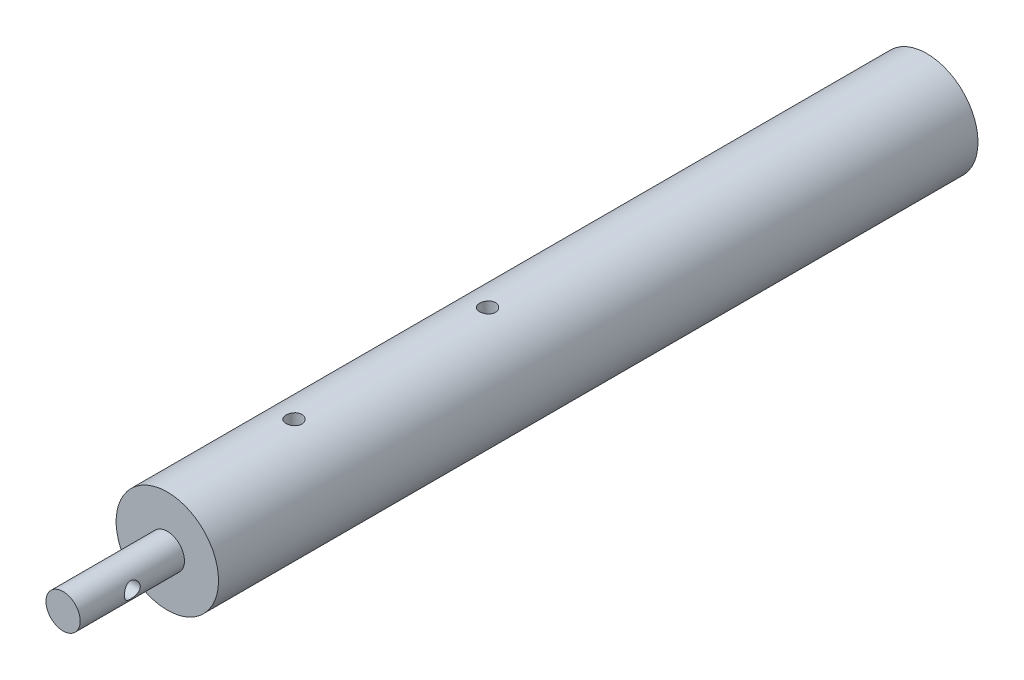
ISO-10303-21;
HEADER;
FILE_DESCRIPTION(('STEP AP214'),'2;1');
FILE_NAME('part.step','',(''),(''),'','','');
FILE_SCHEMA(('AUTOMOTIVE_DESIGN { 1 0 10303 214 1 1 1 1 }'));
ENDSEC;
DATA;
#1=APPLICATION_CONTEXT('core data for automotive mechanical design processes');
#2=APPLICATION_PROTOCOL_DEFINITION('international standard','automotive_design',2000,#1);
#3=PRODUCT_CONTEXT('',#1,'mechanical');
#4=PRODUCT('Part','Part','',(#3));
#5=PRODUCT_RELATED_PRODUCT_CATEGORY('part','',(#4));
#6=PRODUCT_DEFINITION_FORMATION('','',#4);
#7=PRODUCT_DEFINITION_CONTEXT('part definition',#1,'design');
#8=PRODUCT_DEFINITION('design','',#6,#7);
#9=PRODUCT_DEFINITION_SHAPE('','',#8);
#10=(LENGTH_UNIT() NAMED_UNIT(*) SI_UNIT(.MILLI.,.METRE.));
#11=(NAMED_UNIT(*) PLANE_ANGLE_UNIT() SI_UNIT($,.RADIAN.));
#12=(NAMED_UNIT(*) SI_UNIT($,.STERADIAN.) SOLID_ANGLE_UNIT());
#13=UNCERTAINTY_MEASURE_WITH_UNIT(LENGTH_MEASURE(1.E-05),#10,'distance_accuracy_value','');
#14=(GEOMETRIC_REPRESENTATION_CONTEXT(3) GLOBAL_UNCERTAINTY_ASSIGNED_CONTEXT((#13)) GLOBAL_UNIT_ASSIGNED_CONTEXT((#10,
#11,#12)) REPRESENTATION_CONTEXT('',''));
#15=CARTESIAN_POINT('',(0.,0.,0.));
#16=DIRECTION('',(0.,0.,1.));
#17=DIRECTION('',(1.,0.,0.));
#18=AXIS2_PLACEMENT_3D('',#15,#16,#17);
#19=CARTESIAN_POINT('',(0.,0.,129.54));
#20=DIRECTION('',(0.,0.,-1.));
#21=DIRECTION('',(-1.,0.,0.));
#22=AXIS2_PLACEMENT_3D('',#19,#20,#21);
#23=CYLINDRICAL_SURFACE('',#22,8.73125);
#24=CARTESIAN_POINT('',(0.,-8.73125,76.28255));
#25=CARTESIAN_POINT('',(0.0754888041344743,-8.73124876355659,76.2825469101338));
#26=CARTESIAN_POINT('',(0.151020673026684,-8.73026076401459,76.2762088651265));
#27=CARTESIAN_POINT('',(0.299971135901253,-8.72641453990347,76.2510317340889));
#28=CARTESIAN_POINT('',(0.373387634254949,-8.72355452308375,76.2321806679732));
#29=CARTESIAN_POINT('',(0.51593036168142,-8.71628549203304,76.1825560147517));
#30=CARTESIAN_POINT('',(0.585059861670591,-8.71187767629343,76.1517916504597));
#31=CARTESIAN_POINT('',(0.717165385587769,-8.70199942370632,76.0792366950341));
#32=CARTESIAN_POINT('',(0.780142219559996,-8.69652912702646,76.0374475580818));
#33=CARTESIAN_POINT('',(0.898688105879225,-8.68508285997865,75.9436594774592));
#34=CARTESIAN_POINT('',(0.954198620113938,-8.67910343334047,75.8915869569925));
#35=CARTESIAN_POINT('',(1.05573089746048,-8.66733970609661,75.7788686056852));
#36=CARTESIAN_POINT('',(1.10175210015955,-8.66155541703209,75.7182222688548));
#37=CARTESIAN_POINT('',(1.18322919600408,-8.65080337197327,75.5896819542717));
#38=CARTESIAN_POINT('',(1.21862809215192,-8.64584008290526,75.521751442051));
#39=CARTESIAN_POINT('',(1.27749141841027,-8.63733941759142,75.3808191306646));
#40=CARTESIAN_POINT('',(1.30095654280437,-8.63380195839608,75.3078176268002));
#41=CARTESIAN_POINT('',(1.335103674863,-8.62858758502677,75.159432660333));
#42=CARTESIAN_POINT('',(1.3458861490265,-8.62689605602233,75.0840728406619));
#43=CARTESIAN_POINT('',(1.35467321633248,-8.6255207421819,74.9325959955976));
#44=CARTESIAN_POINT('',(1.35267859136139,-8.62583683449079,74.8564790168229));
#45=CARTESIAN_POINT('',(1.33605010655079,-8.62842769021077,74.7063603558542));
#46=CARTESIAN_POINT('',(1.32152841426008,-8.63068507074406,74.6323459056313));
#47=CARTESIAN_POINT('',(1.28043372499645,-8.63687698314903,74.4878169258596));
#48=CARTESIAN_POINT('',(1.2538603664106,-8.6408115653453,74.4173025014005));
#49=CARTESIAN_POINT('',(1.18930084093583,-8.64993363369715,74.2814355014135));
#50=CARTESIAN_POINT('',(1.15126742861874,-8.65512628870146,74.2161057366237));
#51=CARTESIAN_POINT('',(1.06490104186895,-8.6661757282809,74.092712997201));
#52=CARTESIAN_POINT('',(1.01656734722758,-8.67203255928264,74.0346505311576));
#53=CARTESIAN_POINT('',(0.910358001619178,-8.68382711776753,73.926790713911));
#54=CARTESIAN_POINT('',(0.852385968704006,-8.68976504124887,73.8770882422591));
#55=CARTESIAN_POINT('',(0.728873335053536,-8.70099472554581,73.7881031045136));
#56=CARTESIAN_POINT('',(0.663332697064362,-8.7062864831806,73.7488204897113));
#57=CARTESIAN_POINT('',(0.526459092617788,-8.71563366764483,73.68178421331));
#58=CARTESIAN_POINT('',(0.455122334055874,-8.71968827668825,73.6540381732983));
#59=CARTESIAN_POINT('',(0.30872489456195,-8.72609756582709,73.6109467166351));
#60=CARTESIAN_POINT('',(0.233664482720333,-8.72845236856858,73.5956004052967));
#61=CARTESIAN_POINT('',(0.082768989086949,-8.7311804087026,73.5778708927511));
#62=CARTESIAN_POINT('',(0.00694957424105651,-8.73157357617247,73.5753573058388));
#63=CARTESIAN_POINT('',(-0.144027755167406,-8.73038839327229,73.5830180750966));
#64=CARTESIAN_POINT('',(-0.219185691530383,-8.72881010812248,73.593192011534));
#65=CARTESIAN_POINT('',(-0.366309450213318,-8.72387168565007,73.6258305946649));
#66=CARTESIAN_POINT('',(-0.43828976699257,-8.72052080277739,73.6482314258392));
#67=CARTESIAN_POINT('',(-0.577473062752964,-8.71241159900896,73.7046204166358));
#68=CARTESIAN_POINT('',(-0.644675804394614,-8.70765320825182,73.7386091514344));
#69=CARTESIAN_POINT('',(-0.772967668445403,-8.69720799668705,73.817512958888));
#70=CARTESIAN_POINT('',(-0.834005571297915,-8.69151428993084,73.8625103822726));
#71=CARTESIAN_POINT('',(-0.947710129386006,-8.67985282423371,73.9620399936837));
#72=CARTESIAN_POINT('',(-1.00037626349964,-8.67388504826244,74.0165727748193));
#73=CARTESIAN_POINT('',(-1.09631924727438,-8.6622844963886,74.134206822428));
#74=CARTESIAN_POINT('',(-1.13950849366452,-8.65665516901023,74.1973799309768));
#75=CARTESIAN_POINT('',(-1.21466197602658,-8.64643090415414,74.3301609103));
#76=CARTESIAN_POINT('',(-1.24662653087527,-8.64183593729311,74.3997685982065));
#77=CARTESIAN_POINT('',(-1.29828884286972,-8.63422588143133,74.5431862367786));
#78=CARTESIAN_POINT('',(-1.31803198999982,-8.63120495319378,74.61697951333));
#79=CARTESIAN_POINT('',(-1.34483507549268,-8.62706973621449,74.7668850000124));
#80=CARTESIAN_POINT('',(-1.35189595338706,-8.62595530623528,74.8429970379393));
#81=CARTESIAN_POINT('',(-1.35311061766236,-8.62576477365821,74.9945059015716));
#82=CARTESIAN_POINT('',(-1.34740218479754,-8.62666691222767,75.0699016312582));
#83=CARTESIAN_POINT('',(-1.32353628439743,-8.630360466635,75.2186467368127));
#84=CARTESIAN_POINT('',(-1.30537884225367,-8.63315187861941,75.2919961168541));
#85=CARTESIAN_POINT('',(-1.25718023866666,-8.6403016618646,75.4345239175232));
#86=CARTESIAN_POINT('',(-1.22714934495711,-8.64465867895042,75.5037058825722));
#87=CARTESIAN_POINT('',(-1.15607012583308,-8.65445029265093,75.6360718184769));
#88=CARTESIAN_POINT('',(-1.11502137756136,-8.65988493062184,75.699255558999));
#89=CARTESIAN_POINT('',(-1.02257358694004,-8.6712891242348,75.8185304257929));
#90=CARTESIAN_POINT('',(-0.971072684240981,-8.67726359548134,75.8745421417275));
#91=CARTESIAN_POINT('',(-0.859397758119664,-8.68903377058451,75.9771767063263));
#92=CARTESIAN_POINT('',(-0.799221726247093,-8.69482943266529,76.0237973747835));
#93=CARTESIAN_POINT('',(-0.6714861094829,-8.7056281708648,76.1065736719689));
#94=CARTESIAN_POINT('',(-0.603885101952576,-8.71062637486132,76.1426660093515));
#95=CARTESIAN_POINT('',(-0.463533483835271,-8.71921940343818,76.2029292093534));
#96=CARTESIAN_POINT('',(-0.39078823669724,-8.72281566494095,76.2271122851136));
#97=CARTESIAN_POINT('',(-0.264773937532857,-8.72738890877982,76.2574513111474));
#98=CARTESIAN_POINT('',(-0.212278515743084,-8.72882929635414,76.2668487416074));
#99=CARTESIAN_POINT('',(-0.106529205403255,-8.7307602717609,76.2793991335783));
#100=CARTESIAN_POINT('',(-0.0532753272539902,-8.73125087260525,76.2825521806363));
#101=CARTESIAN_POINT('',(0.,-8.73125,76.28255));
#102=B_SPLINE_CURVE_WITH_KNOTS('',3,(#24,#25,#26,#27,#28,#29,#30,#31,#32,#33,#34,#35,#36,#37,
#38,#39,#40,#41,#42,#43,#44,#45,#46,#47,#48,#49,#50,#51,#52,#53,#54,#55,#56,#57,#58,#59,#60,#61,
#62,#63,#64,#65,#66,#67,#68,#69,#70,#71,#72,#73,#74,#75,#76,#77,#78,#79,#80,#81,#82,#83,#84,#85,
#86,#87,#88,#89,#90,#91,#92,#93,#94,#95,#96,#97,#98,#99,#100,#101),.UNSPECIFIED.,.T.,.F.,(4,2,2,
2,2,2,2,2,2,2,2,2,2,2,2,2,2,2,2,2,2,2,2,2,2,2,2,2,2,2,2,2,2,2,2,2,2,2,4),(0.,0.226271720971168,
0.452760389707807,0.679074069099414,0.905357912345743,1.13332363210328,1.36130281103837,
1.59048425874515,1.81965237159635,2.04699261869543,2.27431895398595,2.49963068739619,
2.72494918178259,2.95120959183571,3.17748582749426,3.40617834532588,3.63487198886636,
3.86371647871664,4.09254445510565,4.31904275252833,4.54553355706069,4.77085339300516,
4.99618441453623,5.22325553477207,5.45034078409446,5.6794441662781,5.90854103944891,
6.13678186614073,6.36500578353091,6.59077905830418,6.81655187258194,7.04212987219085,
7.26771653055756,7.49561740993336,7.72357113749991,7.95286823466402,8.18192969170311,
8.34162046005021,8.5013090406454),.UNSPECIFIED.);
#103=CARTESIAN_POINT('',(0.,-8.73125,76.28255));
#104=VERTEX_POINT('',#103);
#105=EDGE_CURVE('E51',#104,#104,#102,.T.);
#106=ORIENTED_EDGE('',*,*,#105,.T.);
#107=EDGE_LOOP('',(#106));
#108=FACE_BOUND('',#107,.T.);
#109=CARTESIAN_POINT('',(0.,8.73125,76.28255));
#110=CARTESIAN_POINT('',(-0.0754888041344743,8.73124876355659,76.2825469101338));
#111=CARTESIAN_POINT('',(-0.151020673026684,8.73026076401459,76.2762088651265));
#112=CARTESIAN_POINT('',(-0.299971135901253,8.72641453990347,76.2510317340889));
#113=CARTESIAN_POINT('',(-0.373387634254949,8.72355452308375,76.2321806679732));
#114=CARTESIAN_POINT('',(-0.515930361681424,8.71628549203304,76.1825560147517));
#115=CARTESIAN_POINT('',(-0.585059861670598,8.71187767629343,76.1517916504597));
#116=CARTESIAN_POINT('',(-0.717165385587775,8.70199942370632,76.0792366950341));
#117=CARTESIAN_POINT('',(-0.780142219559999,8.69652912702646,76.0374475580818));
#118=CARTESIAN_POINT('',(-0.898688105879225,8.68508285997865,75.9436594774592));
#119=CARTESIAN_POINT('',(-0.954198620113938,8.67910343334047,75.8915869569925));
#120=CARTESIAN_POINT('',(-1.05573089746048,8.66733970609661,75.7788686056852));
#121=CARTESIAN_POINT('',(-1.10175210015955,8.66155541703209,75.7182222688548));
#122=CARTESIAN_POINT('',(-1.18322919600408,8.65080337197327,75.5896819542717));
#123=CARTESIAN_POINT('',(-1.21862809215192,8.64584008290526,75.521751442051));
#124=CARTESIAN_POINT('',(-1.27749141841027,8.63733941759142,75.3808191306646));
#125=CARTESIAN_POINT('',(-1.30095654280437,8.63380195839608,75.3078176268002));
#126=CARTESIAN_POINT('',(-1.335103674863,8.62858758502677,75.159432660333));
#127=CARTESIAN_POINT('',(-1.3458861490265,8.62689605602233,75.0840728406619));
#128=CARTESIAN_POINT('',(-1.35467321633248,8.6255207421819,74.9325959955976));
#129=CARTESIAN_POINT('',(-1.35267859136139,8.62583683449079,74.8564790168229));
#130=CARTESIAN_POINT('',(-1.33605010655079,8.62842769021077,74.7063603558542));
#131=CARTESIAN_POINT('',(-1.32152841426008,8.63068507074406,74.6323459056313));
#132=CARTESIAN_POINT('',(-1.28043372499645,8.63687698314903,74.4878169258596));
#133=CARTESIAN_POINT('',(-1.2538603664106,8.6408115653453,74.4173025014005));
#134=CARTESIAN_POINT('',(-1.18930084093584,8.64993363369715,74.2814355014135));
#135=CARTESIAN_POINT('',(-1.15126742861875,8.65512628870146,74.2161057366237));
#136=CARTESIAN_POINT('',(-1.06490104186895,8.6661757282809,74.092712997201));
#137=CARTESIAN_POINT('',(-1.01656734722758,8.67203255928264,74.0346505311576));
#138=CARTESIAN_POINT('',(-0.910358001619178,8.68382711776753,73.926790713911));
#139=CARTESIAN_POINT('',(-0.852385968704006,8.68976504124887,73.8770882422591));
#140=CARTESIAN_POINT('',(-0.728873335053536,8.70099472554581,73.7881031045136));
#141=CARTESIAN_POINT('',(-0.663332697064363,8.7062864831806,73.7488204897113));
#142=CARTESIAN_POINT('',(-0.526459092617789,8.71563366764483,73.68178421331));
#143=CARTESIAN_POINT('',(-0.455122334055874,8.71968827668825,73.6540381732983));
#144=CARTESIAN_POINT('',(-0.30872489456195,8.72609756582709,73.6109467166351));
#145=CARTESIAN_POINT('',(-0.233664482720334,8.72845236856858,73.5956004052967));
#146=CARTESIAN_POINT('',(-0.08276898908695,8.7311804087026,73.5778708927511));
#147=CARTESIAN_POINT('',(-0.00694957424105769,8.73157357617247,73.5753573058388));
#148=CARTESIAN_POINT('',(0.144027755167404,8.73038839327229,73.5830180750966));
#149=CARTESIAN_POINT('',(0.219185691530382,8.72881010812248,73.593192011534));
#150=CARTESIAN_POINT('',(0.366309450213317,8.72387168565007,73.6258305946649));
#151=CARTESIAN_POINT('',(0.438289766992569,8.72052080277739,73.6482314258392));
#152=CARTESIAN_POINT('',(0.577473062752964,8.71241159900896,73.7046204166358));
#153=CARTESIAN_POINT('',(0.644675804394613,8.70765320825182,73.7386091514344));
#154=CARTESIAN_POINT('',(0.772967668445402,8.69720799668705,73.817512958888));
#155=CARTESIAN_POINT('',(0.834005571297915,8.69151428993084,73.8625103822726));
#156=CARTESIAN_POINT('',(0.947710129386006,8.67985282423371,73.9620399936837));
#157=CARTESIAN_POINT('',(1.00037626349964,8.67388504826244,74.0165727748193));
#158=CARTESIAN_POINT('',(1.09631924727438,8.6622844963886,74.134206822428));
#159=CARTESIAN_POINT('',(1.13950849366452,8.65665516901023,74.1973799309768));
#160=CARTESIAN_POINT('',(1.21466197602658,8.64643090415414,74.3301609103));
#161=CARTESIAN_POINT('',(1.24662653087527,8.64183593729311,74.3997685982065));
#162=CARTESIAN_POINT('',(1.29828884286972,8.63422588143133,74.5431862367786));
#163=CARTESIAN_POINT('',(1.31803198999982,8.63120495319378,74.61697951333));
#164=CARTESIAN_POINT('',(1.34483507549268,8.62706973621449,74.7668850000124));
#165=CARTESIAN_POINT('',(1.35189595338706,8.62595530623528,74.8429970379393));
#166=CARTESIAN_POINT('',(1.35311061766236,8.62576477365821,74.9945059015716));
#167=CARTESIAN_POINT('',(1.34740218479754,8.62666691222767,75.0699016312582));
#168=CARTESIAN_POINT('',(1.32353628439743,8.63036046663499,75.2186467368127));
#169=CARTESIAN_POINT('',(1.30537884225368,8.63315187861941,75.291996116854));
#170=CARTESIAN_POINT('',(1.25718023866667,8.64030166186461,75.4345239175232));
#171=CARTESIAN_POINT('',(1.22714934495711,8.64465867895042,75.5037058825722));
#172=CARTESIAN_POINT('',(1.15607012583308,8.65445029265093,75.6360718184769));
#173=CARTESIAN_POINT('',(1.11502137756136,8.65988493062184,75.699255558999));
#174=CARTESIAN_POINT('',(1.02257358694004,8.6712891242348,75.8185304257929));
#175=CARTESIAN_POINT('',(0.971072684240981,8.67726359548134,75.8745421417275));
#176=CARTESIAN_POINT('',(0.859397758119664,8.68903377058451,75.9771767063263));
#177=CARTESIAN_POINT('',(0.799221726247093,8.69482943266529,76.0237973747835));
#178=CARTESIAN_POINT('',(0.6714861094829,8.7056281708648,76.1065736719689));
#179=CARTESIAN_POINT('',(0.603885101952576,8.71062637486132,76.1426660093515));
#180=CARTESIAN_POINT('',(0.463533483835272,8.71921940343818,76.2029292093534));
#181=CARTESIAN_POINT('',(0.39078823669724,8.72281566494095,76.2271122851136));
#182=CARTESIAN_POINT('',(0.264773937532857,8.72738890877982,76.2574513111474));
#183=CARTESIAN_POINT('',(0.212278515743085,8.72882929635414,76.2668487416074));
#184=CARTESIAN_POINT('',(0.106529205403255,8.7307602717609,76.2793991335783));
#185=CARTESIAN_POINT('',(0.0532753272539903,8.73125087260526,76.2825521806363));
#186=CARTESIAN_POINT('',(0.,8.73125,76.28255));
#187=B_SPLINE_CURVE_WITH_KNOTS('',3,(#109,#110,#111,#112,#113,#114,#115,#116,#117,#118,#119,
#120,#121,#122,#123,#124,#125,#126,#127,#128,#129,#130,#131,#132,#133,#134,#135,#136,#137,#138,
#139,#140,#141,#142,#143,#144,#145,#146,#147,#148,#149,#150,#151,#152,#153,#154,#155,#156,#157,
#158,#159,#160,#161,#162,#163,#164,#165,#166,#167,#168,#169,#170,#171,#172,#173,#174,#175,#176,
#177,#178,#179,#180,#181,#182,#183,#184,#185,#186),.UNSPECIFIED.,.T.,.F.,(4,2,2,2,2,2,2,2,2,2,2,
2,2,2,2,2,2,2,2,2,2,2,2,2,2,2,2,2,2,2,2,2,2,2,2,2,2,2,4),(0.,0.226271720971168,
0.452760389707807,0.67907406909943,0.905357912345742,1.13332363210328,1.36130281103836,
1.59048425874515,1.81965237159635,2.04699261869543,2.27431895398595,2.49963068739619,
2.72494918178258,2.95120959183571,3.17748582749426,3.40617834532588,3.63487198886636,
3.86371647871663,4.09254445510565,4.31904275252832,4.54553355706069,4.77085339300516,
4.99618441453623,5.22325553477207,5.45034078409446,5.6794441662781,5.90854103944891,
6.13678186614073,6.36500578353091,6.59077905830416,6.81655187258193,7.04212987219085,
7.26771653055756,7.49561740993337,7.72357113749991,7.95286823466402,8.18192969170311,
8.34162046005021,8.5013090406454),.UNSPECIFIED.);
#188=CARTESIAN_POINT('',(0.,8.73125,76.28255));
#189=VERTEX_POINT('',#188);
#190=EDGE_CURVE('E55',#189,#189,#187,.T.);
#191=ORIENTED_EDGE('',*,*,#190,.T.);
#192=EDGE_LOOP('',(#191));
#193=FACE_BOUND('',#192,.T.);
#194=CARTESIAN_POINT('',(0.,-8.73125,109.30255));
#195=CARTESIAN_POINT('',(0.0754888041344743,-8.73124876355659,109.302546910134));
#196=CARTESIAN_POINT('',(0.151020673026684,-8.73026076401459,109.296208865126));
#197=CARTESIAN_POINT('',(0.299971135901253,-8.72641453990347,109.271031734089));
#198=CARTESIAN_POINT('',(0.373387634254949,-8.72355452308375,109.252180667973));
#199=CARTESIAN_POINT('',(0.51593036168142,-8.71628549203304,109.202556014752));
#200=CARTESIAN_POINT('',(0.585059861670591,-8.71187767629343,109.17179165046));
#201=CARTESIAN_POINT('',(0.717165385587769,-8.70199942370632,109.099236695034));
#202=CARTESIAN_POINT('',(0.780142219559996,-8.69652912702646,109.057447558082));
#203=CARTESIAN_POINT('',(0.898688105879225,-8.68508285997865,108.963659477459));
#204=CARTESIAN_POINT('',(0.954198620113938,-8.67910343334047,108.911586956993));
#205=CARTESIAN_POINT('',(1.05573089746048,-8.66733970609661,108.798868605685));
#206=CARTESIAN_POINT('',(1.10175210015955,-8.66155541703209,108.738222268855));
#207=CARTESIAN_POINT('',(1.18322919600408,-8.65080337197327,108.609681954272));
#208=CARTESIAN_POINT('',(1.21862809215192,-8.64584008290526,108.541751442051));
#209=CARTESIAN_POINT('',(1.27749141841027,-8.63733941759142,108.400819130665));
#210=CARTESIAN_POINT('',(1.30095654280437,-8.63380195839608,108.3278176268));
#211=CARTESIAN_POINT('',(1.335103674863,-8.62858758502677,108.179432660333));
#212=CARTESIAN_POINT('',(1.3458861490265,-8.62689605602233,108.104072840662));
#213=CARTESIAN_POINT('',(1.35467321633248,-8.6255207421819,107.952595995598));
#214=CARTESIAN_POINT('',(1.35267859136139,-8.62583683449079,107.876479016823));
#215=CARTESIAN_POINT('',(1.33605010655079,-8.62842769021077,107.726360355854));
#216=CARTESIAN_POINT('',(1.32152841426008,-8.63068507074407,107.652345905631));
#217=CARTESIAN_POINT('',(1.28043372499645,-8.63687698314903,107.50781692586));
#218=CARTESIAN_POINT('',(1.2538603664106,-8.6408115653453,107.437302501401));
#219=CARTESIAN_POINT('',(1.18930084093583,-8.64993363369715,107.301435501414));
#220=CARTESIAN_POINT('',(1.15126742861874,-8.65512628870146,107.236105736624));
#221=CARTESIAN_POINT('',(1.06490104186894,-8.6661757282809,107.112712997201));
#222=CARTESIAN_POINT('',(1.01656734722758,-8.67203255928264,107.054650531158));
#223=CARTESIAN_POINT('',(0.910358001619178,-8.68382711776753,106.946790713911));
#224=CARTESIAN_POINT('',(0.852385968704006,-8.68976504124887,106.897088242259));
#225=CARTESIAN_POINT('',(0.728873335053536,-8.70099472554581,106.808103104514));
#226=CARTESIAN_POINT('',(0.663332697064363,-8.7062864831806,106.768820489711));
#227=CARTESIAN_POINT('',(0.526459092617786,-8.71563366764483,106.70178421331));
#228=CARTESIAN_POINT('',(0.455122334055869,-8.71968827668825,106.674038173298));
#229=CARTESIAN_POINT('',(0.308724894561944,-8.72609756582709,106.630946716635));
#230=CARTESIAN_POINT('',(0.23366448272033,-8.72845236856858,106.615600405297));
#231=CARTESIAN_POINT('',(0.0827689890869492,-8.7311804087026,106.597870892751));
#232=CARTESIAN_POINT('',(0.00694957424105654,-8.73157357617247,106.595357305839));
#233=CARTESIAN_POINT('',(-0.144027755167406,-8.73038839327229,106.603018075097));
#234=CARTESIAN_POINT('',(-0.219185691530383,-8.72881010812248,106.613192011534));
#235=CARTESIAN_POINT('',(-0.366309450213318,-8.72387168565007,106.645830594665));
#236=CARTESIAN_POINT('',(-0.43828976699257,-8.72052080277739,106.668231425839));
#237=CARTESIAN_POINT('',(-0.577473062752964,-8.71241159900896,106.724620416636));
#238=CARTESIAN_POINT('',(-0.644675804394614,-8.70765320825182,106.758609151434));
#239=CARTESIAN_POINT('',(-0.772967668445403,-8.69720799668705,106.837512958888));
#240=CARTESIAN_POINT('',(-0.834005571297915,-8.69151428993084,106.882510382273));
#241=CARTESIAN_POINT('',(-0.947710129386006,-8.67985282423371,106.982039993684));
#242=CARTESIAN_POINT('',(-1.00037626349964,-8.67388504826244,107.036572774819));
#243=CARTESIAN_POINT('',(-1.09631924727438,-8.6622844963886,107.154206822428));
#244=CARTESIAN_POINT('',(-1.13950849366452,-8.65665516901023,107.217379930977));
#245=CARTESIAN_POINT('',(-1.21466197602658,-8.64643090415414,107.3501609103));
#246=CARTESIAN_POINT('',(-1.24662653087527,-8.64183593729311,107.419768598207));
#247=CARTESIAN_POINT('',(-1.29828884286972,-8.63422588143133,107.563186236779));
#248=CARTESIAN_POINT('',(-1.31803198999982,-8.63120495319378,107.63697951333));
#249=CARTESIAN_POINT('',(-1.34483507549268,-8.62706973621449,107.786885000012));
#250=CARTESIAN_POINT('',(-1.35189595338706,-8.62595530623528,107.862997037939));
#251=CARTESIAN_POINT('',(-1.35311061766236,-8.62576477365821,108.014505901572));
#252=CARTESIAN_POINT('',(-1.34740218479754,-8.62666691222767,108.089901631258));
#253=CARTESIAN_POINT('',(-1.32353628439743,-8.630360466635,108.238646736813));
#254=CARTESIAN_POINT('',(-1.30537884225367,-8.63315187861941,108.311996116854));
#255=CARTESIAN_POINT('',(-1.25718023866666,-8.6403016618646,108.454523917523));
#256=CARTESIAN_POINT('',(-1.22714934495711,-8.64465867895042,108.523705882572));
#257=CARTESIAN_POINT('',(-1.15607012583308,-8.65445029265093,108.656071818477));
#258=CARTESIAN_POINT('',(-1.11502137756136,-8.65988493062184,108.719255558999));
#259=CARTESIAN_POINT('',(-1.02257358694004,-8.6712891242348,108.838530425793));
#260=CARTESIAN_POINT('',(-0.971072684240981,-8.67726359548134,108.894542141728));
#261=CARTESIAN_POINT('',(-0.859397758119664,-8.68903377058451,108.997176706326));
#262=CARTESIAN_POINT('',(-0.799221726247093,-8.69482943266529,109.043797374783));
#263=CARTESIAN_POINT('',(-0.6714861094829,-8.7056281708648,109.126573671969));
#264=CARTESIAN_POINT('',(-0.603885101952576,-8.71062637486132,109.162666009351));
#265=CARTESIAN_POINT('',(-0.463533483835271,-8.71921940343818,109.222929209353));
#266=CARTESIAN_POINT('',(-0.39078823669724,-8.72281566494095,109.247112285114));
#267=CARTESIAN_POINT('',(-0.264773937532857,-8.72738890877982,109.277451311147));
#268=CARTESIAN_POINT('',(-0.212278515743084,-8.72882929635414,109.286848741607));
#269=CARTESIAN_POINT('',(-0.106529205403255,-8.7307602717609,109.299399133578));
#270=CARTESIAN_POINT('',(-0.0532753272539902,-8.73125087260525,109.302552180636));
#271=CARTESIAN_POINT('',(0.,-8.73125,109.30255));
#272=B_SPLINE_CURVE_WITH_KNOTS('',3,(#194,#195,#196,#197,#198,#199,#200,#201,#202,#203,#204,
#205,#206,#207,#208,#209,#210,#211,#212,#213,#214,#215,#216,#217,#218,#219,#220,#221,#222,#223,
#224,#225,#226,#227,#228,#229,#230,#231,#232,#233,#234,#235,#236,#237,#238,#239,#240,#241,#242,
#243,#244,#245,#246,#247,#248,#249,#250,#251,#252,#253,#254,#255,#256,#257,#258,#259,#260,#261,
#262,#263,#264,#265,#266,#267,#268,#269,#270,#271),.UNSPECIFIED.,.T.,.F.,(4,2,2,2,2,2,2,2,2,2,2,
2,2,2,2,2,2,2,2,2,2,2,2,2,2,2,2,2,2,2,2,2,2,2,2,2,2,2,4),(0.,0.226271720971168,
0.452760389707807,0.679074069099414,0.905357912345743,1.13332363210328,1.36130281103837,
1.59048425874515,1.81965237159635,2.04699261869543,2.27431895398595,2.49963068739619,
2.72494918178259,2.95120959183572,3.17748582749426,3.40617834532588,3.63487198886636,
3.86371647871664,4.09254445510566,4.31904275252833,4.54553355706069,4.77085339300516,
4.99618441453623,5.22325553477207,5.45034078409446,5.6794441662781,5.90854103944891,
6.13678186614075,6.36500578353091,6.59077905830418,6.81655187258194,7.04212987219085,
7.26771653055756,7.49561740993336,7.72357113749991,7.95286823466402,8.18192969170311,
8.34162046005021,8.5013090406454),.UNSPECIFIED.);
#273=CARTESIAN_POINT('',(0.,-8.73125,109.30255));
#274=VERTEX_POINT('',#273);
#275=EDGE_CURVE('E60',#274,#274,#272,.T.);
#276=ORIENTED_EDGE('',*,*,#275,.T.);
#277=EDGE_LOOP('',(#276));
#278=FACE_BOUND('',#277,.T.);
#279=CARTESIAN_POINT('',(0.,8.73125,109.30255));
#280=CARTESIAN_POINT('',(-0.0754888041344742,8.73124876355659,109.302546910134));
#281=CARTESIAN_POINT('',(-0.151020673026684,8.73026076401459,109.296208865126));
#282=CARTESIAN_POINT('',(-0.299971135901253,8.72641453990347,109.271031734089));
#283=CARTESIAN_POINT('',(-0.373387634254949,8.72355452308375,109.252180667973));
#284=CARTESIAN_POINT('',(-0.515930361681424,8.71628549203304,109.202556014752));
#285=CARTESIAN_POINT('',(-0.585059861670598,8.71187767629343,109.17179165046));
#286=CARTESIAN_POINT('',(-0.717165385587775,8.70199942370632,109.099236695034));
#287=CARTESIAN_POINT('',(-0.780142219559999,8.69652912702646,109.057447558082));
#288=CARTESIAN_POINT('',(-0.898688105879225,8.68508285997865,108.963659477459));
#289=CARTESIAN_POINT('',(-0.954198620113938,8.67910343334047,108.911586956993));
#290=CARTESIAN_POINT('',(-1.05573089746048,8.66733970609661,108.798868605685));
#291=CARTESIAN_POINT('',(-1.10175210015955,8.66155541703209,108.738222268855));
#292=CARTESIAN_POINT('',(-1.18322919600408,8.65080337197327,108.609681954272));
#293=CARTESIAN_POINT('',(-1.21862809215192,8.64584008290526,108.541751442051));
#294=CARTESIAN_POINT('',(-1.27749141841027,8.63733941759142,108.400819130665));
#295=CARTESIAN_POINT('',(-1.30095654280437,8.63380195839608,108.3278176268));
#296=CARTESIAN_POINT('',(-1.335103674863,8.62858758502677,108.179432660333));
#297=CARTESIAN_POINT('',(-1.3458861490265,8.62689605602233,108.104072840662));
#298=CARTESIAN_POINT('',(-1.35467321633248,8.6255207421819,107.952595995598));
#299=CARTESIAN_POINT('',(-1.35267859136139,8.62583683449079,107.876479016823));
#300=CARTESIAN_POINT('',(-1.33605010655079,8.62842769021077,107.726360355854));
#301=CARTESIAN_POINT('',(-1.32152841426008,8.63068507074407,107.652345905631));
#302=CARTESIAN_POINT('',(-1.28043372499645,8.63687698314903,107.50781692586));
#303=CARTESIAN_POINT('',(-1.2538603664106,8.6408115653453,107.437302501401));
#304=CARTESIAN_POINT('',(-1.18930084093584,8.64993363369715,107.301435501414));
#305=CARTESIAN_POINT('',(-1.15126742861875,8.65512628870146,107.236105736624));
#306=CARTESIAN_POINT('',(-1.06490104186895,8.6661757282809,107.112712997201));
#307=CARTESIAN_POINT('',(-1.01656734722758,8.67203255928264,107.054650531158));
#308=CARTESIAN_POINT('',(-0.910358001619178,8.68382711776753,106.946790713911));
#309=CARTESIAN_POINT('',(-0.852385968704006,8.68976504124887,106.897088242259));
#310=CARTESIAN_POINT('',(-0.728873335053536,8.70099472554581,106.808103104514));
#311=CARTESIAN_POINT('',(-0.663332697064363,8.7062864831806,106.768820489711));
#312=CARTESIAN_POINT('',(-0.526459092617787,8.71563366764483,106.70178421331));
#313=CARTESIAN_POINT('',(-0.455122334055869,8.71968827668825,106.674038173298));
#314=CARTESIAN_POINT('',(-0.308724894561945,8.72609756582709,106.630946716635));
#315=CARTESIAN_POINT('',(-0.233664482720331,8.72845236856858,106.615600405297));
#316=CARTESIAN_POINT('',(-0.0827689890869501,8.7311804087026,106.597870892751));
#317=CARTESIAN_POINT('',(-0.0069495742410577,8.73157357617247,106.595357305839));
#318=CARTESIAN_POINT('',(0.144027755167404,8.73038839327229,106.603018075097));
#319=CARTESIAN_POINT('',(0.219185691530382,8.72881010812248,106.613192011534));
#320=CARTESIAN_POINT('',(0.366309450213317,8.72387168565007,106.645830594665));
#321=CARTESIAN_POINT('',(0.438289766992569,8.72052080277739,106.668231425839));
#322=CARTESIAN_POINT('',(0.577473062752964,8.71241159900896,106.724620416636));
#323=CARTESIAN_POINT('',(0.644675804394613,8.70765320825182,106.758609151434));
#324=CARTESIAN_POINT('',(0.772967668445402,8.69720799668705,106.837512958888));
#325=CARTESIAN_POINT('',(0.834005571297915,8.69151428993084,106.882510382273));
#326=CARTESIAN_POINT('',(0.947710129386006,8.67985282423371,106.982039993684));
#327=CARTESIAN_POINT('',(1.00037626349964,8.67388504826244,107.036572774819));
#328=CARTESIAN_POINT('',(1.09631924727438,8.6622844963886,107.154206822428));
#329=CARTESIAN_POINT('',(1.13950849366452,8.65665516901023,107.217379930977));
#330=CARTESIAN_POINT('',(1.21466197602658,8.64643090415414,107.3501609103));
#331=CARTESIAN_POINT('',(1.24662653087527,8.64183593729311,107.419768598207));
#332=CARTESIAN_POINT('',(1.29828884286972,8.63422588143133,107.563186236779));
#333=CARTESIAN_POINT('',(1.31803198999982,8.63120495319378,107.63697951333));
#334=CARTESIAN_POINT('',(1.34483507549268,8.62706973621449,107.786885000012));
#335=CARTESIAN_POINT('',(1.35189595338706,8.62595530623528,107.862997037939));
#336=CARTESIAN_POINT('',(1.35311061766236,8.62576477365821,108.014505901572));
#337=CARTESIAN_POINT('',(1.34740218479754,8.62666691222767,108.089901631258));
#338=CARTESIAN_POINT('',(1.32353628439743,8.63036046663499,108.238646736813));
#339=CARTESIAN_POINT('',(1.30537884225368,8.63315187861941,108.311996116854));
#340=CARTESIAN_POINT('',(1.25718023866667,8.64030166186461,108.454523917523));
#341=CARTESIAN_POINT('',(1.22714934495711,8.64465867895042,108.523705882572));
#342=CARTESIAN_POINT('',(1.15607012583308,8.65445029265093,108.656071818477));
#343=CARTESIAN_POINT('',(1.11502137756136,8.65988493062184,108.719255558999));
#344=CARTESIAN_POINT('',(1.02257358694005,8.6712891242348,108.838530425793));
#345=CARTESIAN_POINT('',(0.971072684240984,8.67726359548134,108.894542141728));
#346=CARTESIAN_POINT('',(0.859397758119669,8.68903377058451,108.997176706326));
#347=CARTESIAN_POINT('',(0.799221726247097,8.69482943266529,109.043797374783));
#348=CARTESIAN_POINT('',(0.671486109482904,8.7056281708648,109.126573671969));
#349=CARTESIAN_POINT('',(0.603885101952581,8.71062637486132,109.162666009351));
#350=CARTESIAN_POINT('',(0.463533483835277,8.71921940343818,109.222929209353));
#351=CARTESIAN_POINT('',(0.390788236697244,8.72281566494095,109.247112285114));
#352=CARTESIAN_POINT('',(0.264773937532858,8.72738890877982,109.277451311147));
#353=CARTESIAN_POINT('',(0.212278515743085,8.72882929635414,109.286848741607));
#354=CARTESIAN_POINT('',(0.106529205403255,8.7307602717609,109.299399133578));
#355=CARTESIAN_POINT('',(0.0532753272539903,8.73125087260526,109.302552180636));
#356=CARTESIAN_POINT('',(0.,8.73125,109.30255));
#357=B_SPLINE_CURVE_WITH_KNOTS('',3,(#279,#280,#281,#282,#283,#284,#285,#286,#287,#288,#289,
#290,#291,#292,#293,#294,#295,#296,#297,#298,#299,#300,#301,#302,#303,#304,#305,#306,#307,#308,
#309,#310,#311,#312,#313,#314,#315,#316,#317,#318,#319,#320,#321,#322,#323,#324,#325,#326,#327,
#328,#329,#330,#331,#332,#333,#334,#335,#336,#337,#338,#339,#340,#341,#342,#343,#344,#345,#346,
#347,#348,#349,#350,#351,#352,#353,#354,#355,#356),.UNSPECIFIED.,.T.,.F.,(4,2,2,2,2,2,2,2,2,2,2,
2,2,2,2,2,2,2,2,2,2,2,2,2,2,2,2,2,2,2,2,2,2,2,2,2,2,2,4),(0.,0.226271720971168,
0.452760389707807,0.67907406909943,0.905357912345742,1.13332363210328,1.36130281103836,
1.59048425874515,1.81965237159635,2.04699261869543,2.27431895398595,2.49963068739619,
2.72494918178258,2.95120959183571,3.17748582749426,3.40617834532588,3.63487198886636,
3.86371647871664,4.09254445510565,4.31904275252832,4.54553355706069,4.77085339300516,
4.99618441453623,5.22325553477207,5.45034078409446,5.6794441662781,5.90854103944891,
6.13678186614075,6.36500578353091,6.59077905830416,6.81655187258193,7.04212987219085,
7.26771653055756,7.49561740993335,7.72357113749991,7.95286823466401,8.18192969170311,
8.34162046005021,8.5013090406454),.UNSPECIFIED.);
#358=CARTESIAN_POINT('',(0.,8.73125,109.30255));
#359=VERTEX_POINT('',#358);
#360=EDGE_CURVE('E90',#359,#359,#357,.T.);
#361=ORIENTED_EDGE('',*,*,#360,.T.);
#362=EDGE_LOOP('',(#361));
#363=FACE_BOUND('',#362,.T.);
#364=CARTESIAN_POINT('',(0.,0.,129.54));
#365=DIRECTION('',(0.,0.,1.));
#366=DIRECTION('',(1.,0.,0.));
#367=AXIS2_PLACEMENT_3D('',#364,#365,#366);
#368=CIRCLE('',#367,8.73125);
#369=CARTESIAN_POINT('',(8.73125,0.,129.54));
#370=VERTEX_POINT('',#369);
#371=EDGE_CURVE('E106',#370,#370,#368,.T.);
#372=ORIENTED_EDGE('',*,*,#371,.F.);
#373=EDGE_LOOP('',(#372));
#374=FACE_BOUND('',#373,.T.);
#375=CARTESIAN_POINT('',(0.,0.,0.));
#376=DIRECTION('',(0.,0.,1.));
#377=DIRECTION('',(1.,0.,0.));
#378=AXIS2_PLACEMENT_3D('',#375,#376,#377);
#379=CIRCLE('',#378,8.73125);
#380=CARTESIAN_POINT('',(8.73125,0.,0.));
#381=VERTEX_POINT('',#380);
#382=EDGE_CURVE('E111',#381,#381,#379,.T.);
#383=ORIENTED_EDGE('',*,*,#382,.T.);
#384=EDGE_LOOP('',(#383));
#385=FACE_BOUND('',#384,.T.);
#386=ADVANCED_FACE('F39',(#108,#193,#278,#363,#374,#385),#23,.T.);
#387=CARTESIAN_POINT('',(0.,0.,129.54));
#388=DIRECTION('',(0.,0.,1.));
#389=DIRECTION('',(1.,0.,0.));
#390=AXIS2_PLACEMENT_3D('',#387,#388,#389);
#391=PLANE('',#390);
#392=CARTESIAN_POINT('',(0.,0.,129.54));
#393=DIRECTION('',(0.,0.,1.));
#394=DIRECTION('',(1.,0.,0.));
#395=AXIS2_PLACEMENT_3D('',#392,#393,#394);
#396=CIRCLE('',#395,2.921);
#397=CARTESIAN_POINT('',(2.921,0.,129.54));
#398=VERTEX_POINT('',#397);
#399=EDGE_CURVE('E102',#398,#398,#396,.T.);
#400=ORIENTED_EDGE('',*,*,#399,.F.);
#401=EDGE_LOOP('',(#400));
#402=FACE_BOUND('',#401,.T.);
#403=ORIENTED_EDGE('',*,*,#371,.T.);
#404=EDGE_LOOP('',(#403));
#405=FACE_BOUND('',#404,.T.);
#406=ADVANCED_FACE('F132',(#402,#405),#391,.T.);
#407=CARTESIAN_POINT('',(0.,0.,0.));
#408=DIRECTION('',(0.,0.,1.));
#409=DIRECTION('',(1.,0.,0.));
#410=AXIS2_PLACEMENT_3D('',#407,#408,#409);
#411=PLANE('',#410);
#412=ORIENTED_EDGE('',*,*,#382,.F.);
#413=EDGE_LOOP('',(#412));
#414=FACE_BOUND('',#413,.T.);
#415=ADVANCED_FACE('F136',(#414),#411,.F.);
#416=CARTESIAN_POINT('',(0.,0.,147.32));
#417=DIRECTION('',(0.,0.,-1.));
#418=DIRECTION('',(-1.,0.,0.));
#419=AXIS2_PLACEMENT_3D('',#416,#417,#418);
#420=CYLINDRICAL_SURFACE('',#419,2.921);
#421=CARTESIAN_POINT('',(2.921,0.,137.07745));
#422=CARTESIAN_POINT('',(2.92099679414533,-0.0717208021241466,137.077453832816));
#423=CARTESIAN_POINT('',(2.91832934138776,-0.14354522575953,137.083188251755));
#424=CARTESIAN_POINT('',(2.90792322620984,-0.285109783479947,137.105890376766));
#425=CARTESIAN_POINT('',(2.90017316858883,-0.354844865024274,137.122883325342));
#426=CARTESIAN_POINT('',(2.88042089503107,-0.48996063400054,137.16731711919));
#427=CARTESIAN_POINT('',(2.86843434287492,-0.555356321752895,137.194719504731));
#428=CARTESIAN_POINT('',(2.84133942621757,-0.680543149847609,137.259013987917));
#429=CARTESIAN_POINT('',(2.82623161582999,-0.740335282248107,137.295904401448));
#430=CARTESIAN_POINT('',(2.79336444450645,-0.856259295102952,137.380413836853));
#431=CARTESIAN_POINT('',(2.77550587763046,-0.912018407156849,137.428505137932));
#432=CARTESIAN_POINT('',(2.73952007771378,-1.01501369415517,137.533044626658));
#433=CARTESIAN_POINT('',(2.72139267878884,-1.06224434776191,137.589498185306));
#434=CARTESIAN_POINT('',(2.68560288055894,-1.14985237423791,137.713512451783));
#435=CARTESIAN_POINT('',(2.66804437770388,-1.18959820537778,137.781552625301));
#436=CARTESIAN_POINT('',(2.63700280020421,-1.25691736309703,137.924269054357));
#437=CARTESIAN_POINT('',(2.62351716140584,-1.2844983533547,137.998941096182));
#438=CARTESIAN_POINT('',(2.60324724016302,-1.3250799273013,138.148537320254));
#439=CARTESIAN_POINT('',(2.59613341920486,-1.3388028912364,138.223218888576));
#440=CARTESIAN_POINT('',(2.58849580188384,-1.35351652293702,138.374136490455));
#441=CARTESIAN_POINT('',(2.58796699647764,-1.35451686846686,138.450371298283));
#442=CARTESIAN_POINT('',(2.5932872361255,-1.34429234758323,138.594152894997));
#443=CARTESIAN_POINT('',(2.598510689572,-1.33426675959951,138.66181326584));
#444=CARTESIAN_POINT('',(2.61366856250788,-1.30432215406162,138.794353284431));
#445=CARTESIAN_POINT('',(2.62360416594759,-1.28440065005137,138.859232228862));
#446=CARTESIAN_POINT('',(2.64729706065089,-1.23483820296949,138.986163203557));
#447=CARTESIAN_POINT('',(2.66113693688236,-1.20498440280578,139.048115993844));
#448=CARTESIAN_POINT('',(2.69107118706757,-1.13656042832854,139.16640747129));
#449=CARTESIAN_POINT('',(2.70716654005858,-1.09798646436125,139.222743702191));
#450=CARTESIAN_POINT('',(2.74188029154099,-1.00840272259513,139.334531448535));
#451=CARTESIAN_POINT('',(2.76058465239359,-0.956505191023101,139.389247143828));
#452=CARTESIAN_POINT('',(2.7969912679283,-0.844137441633092,139.489478226424));
#453=CARTESIAN_POINT('',(2.81469316521762,-0.783664193038304,139.534990347201));
#454=CARTESIAN_POINT('',(2.84785619887924,-0.653173810683609,139.616967131919));
#455=CARTESIAN_POINT('',(2.86321872702706,-0.58289903119204,139.653064670156));
#456=CARTESIAN_POINT('',(2.88917500217637,-0.436380325371229,139.712655908382));
#457=CARTESIAN_POINT('',(2.89977201198159,-0.360140525222287,139.736158234045));
#458=CARTESIAN_POINT('',(2.91434899855339,-0.209942230255426,139.768195484574));
#459=CARTESIAN_POINT('',(2.91876244631563,-0.136235701107255,139.777713485145));
#460=CARTESIAN_POINT('',(2.92191321496068,0.0118499076945469,139.784525251248));
#461=CARTESIAN_POINT('',(2.92065269153025,0.0862287212133572,139.781823659313));
#462=CARTESIAN_POINT('',(2.91286574542063,0.228489633904358,139.764910450703));
#463=CARTESIAN_POINT('',(2.90668276536028,0.296482160092673,139.751449298088));
#464=CARTESIAN_POINT('',(2.89007864387436,0.429135621805891,139.714514025729));
#465=CARTESIAN_POINT('',(2.87965700318168,0.493796163848856,139.691038726413));
#466=CARTESIAN_POINT('',(2.85514292103222,0.620222616416477,139.634023689805));
#467=CARTESIAN_POINT('',(2.84094737246992,0.68183818520315,139.600196428563));
#468=CARTESIAN_POINT('',(2.81032317937011,0.798737768650197,139.523751640433));
#469=CARTESIAN_POINT('',(2.79389355454187,0.854018984126945,139.481130250497));
#470=CARTESIAN_POINT('',(2.7587636832987,0.96174083398214,139.384017735351));
#471=CARTESIAN_POINT('',(2.73999004345299,1.01352029740397,139.32881811895));
#472=CARTESIAN_POINT('',(2.70344293978459,1.10732891224657,139.210337812548));
#473=CARTESIAN_POINT('',(2.68566993503106,1.14935361556898,139.147053456277));
#474=CARTESIAN_POINT('',(2.65268029556488,1.22361555097783,139.011633796219));
#475=CARTESIAN_POINT('',(2.63755953073433,1.25551053566709,138.939285546821));
#476=CARTESIAN_POINT('',(2.61276079577261,1.30634434666327,138.789314248172));
#477=CARTESIAN_POINT('',(2.60307691889778,1.32529723838048,138.71169702644));
#478=CARTESIAN_POINT('',(2.59129901415019,1.34816944333331,138.560846803517));
#479=CARTESIAN_POINT('',(2.58860425305321,1.35328048059982,138.48784154637));
#480=CARTESIAN_POINT('',(2.58945589650712,1.35165151236517,138.342010059894));
#481=CARTESIAN_POINT('',(2.59300062638662,1.34491468681563,138.269183787778));
#482=CARTESIAN_POINT('',(2.60533214096425,1.3208502845641,138.131155104301));
#483=CARTESIAN_POINT('',(2.61373055259158,1.3043052313305,138.065777726699));
#484=CARTESIAN_POINT('',(2.63443336624184,1.2619643336022,137.938753669672));
#485=CARTESIAN_POINT('',(2.6467389250447,1.23616574914243,137.877108101559));
#486=CARTESIAN_POINT('',(2.67486956717175,1.17411457358406,137.754830770479));
#487=CARTESIAN_POINT('',(2.69087325909225,1.13728468305622,137.69453407511));
#488=CARTESIAN_POINT('',(2.72421384484477,1.05492781933359,137.580609351498));
#489=CARTESIAN_POINT('',(2.74155134905658,1.00939685003275,137.526984406115));
#490=CARTESIAN_POINT('',(2.77764672616638,0.905659848526109,137.422473548193));
#491=CARTESIAN_POINT('',(2.796376921037,0.846648250436784,137.372373516377));
#492=CARTESIAN_POINT('',(2.83151918288201,0.720434850062727,137.282673748681));
#493=CARTESIAN_POINT('',(2.84793015531342,0.653229208334235,137.243078963005));
#494=CARTESIAN_POINT('',(2.87653600285451,0.512725946986378,137.175996043336));
#495=CARTESIAN_POINT('',(2.88875731588384,0.439470289421536,137.148431680566));
#496=CARTESIAN_POINT('',(2.90767722241299,0.288754172972365,137.106332184722));
#497=CARTESIAN_POINT('',(2.91439231731002,0.211307024642047,137.09175810999));
#498=CARTESIAN_POINT('',(2.91897311492839,0.111059383971041,137.081832667125));
#499=CARTESIAN_POINT('',(2.91973171296081,0.0888892504120894,137.08019090918));
#500=CARTESIAN_POINT('',(2.92074565737772,0.0444827352490912,137.077998971024));
#501=CARTESIAN_POINT('',(2.92100099439173,0.022246352419238,137.077448811137));
#502=CARTESIAN_POINT('',(2.921,0.,137.07745));
#503=B_SPLINE_CURVE_WITH_KNOTS('',3,(#421,#422,#423,#424,#425,#426,#427,#428,#429,#430,#431,
#432,#433,#434,#435,#436,#437,#438,#439,#440,#441,#442,#443,#444,#445,#446,#447,#448,#449,#450,
#451,#452,#453,#454,#455,#456,#457,#458,#459,#460,#461,#462,#463,#464,#465,#466,#467,#468,#469,
#470,#471,#472,#473,#474,#475,#476,#477,#478,#479,#480,#481,#482,#483,#484,#485,#486,#487,#488,
#489,#490,#491,#492,#493,#494,#495,#496,#497,#498,#499,#500,#501,#502),.UNSPECIFIED.,.T.,.F.,(4,
2,2,2,2,2,2,2,2,2,2,2,2,2,2,2,2,2,2,2,2,2,2,2,2,2,2,2,2,2,2,2,2,2,2,2,2,2,2,2,4),(0.,
0.215071399600787,0.430626645357568,0.645393105765549,0.86012147162579,1.08646131131152,
1.31294716247456,1.55391888852431,1.79473858818796,2.02223199918455,2.24955235151208,
2.45439091834647,2.65928097914235,2.86887998461301,3.07857025440923,3.31063511314158,
3.54278219214593,3.78295391553134,4.022960949436,4.24511993540985,4.46719452462956,
4.67500470533989,4.88283937087176,5.09707073513493,5.31139640719409,5.54429289726653,
5.77729537869796,6.01749178385063,6.25742672734872,6.47592795939557,6.69437055493376,
6.89736768060992,7.10042496330042,7.31687577792601,7.53342624090859,7.77123852393801,
8.00916266888289,8.24555655025269,8.48123937461414,8.54794896131243,8.61465979009731),.UNSPECIFIED.);
#504=CARTESIAN_POINT('',(2.921,0.,137.07745));
#505=VERTEX_POINT('',#504);
#506=EDGE_CURVE('E10',#505,#505,#503,.T.);
#507=ORIENTED_EDGE('',*,*,#506,.T.);
#508=EDGE_LOOP('',(#507));
#509=FACE_BOUND('',#508,.T.);
#510=CARTESIAN_POINT('',(-2.921,0.,139.78255));
#511=CARTESIAN_POINT('',(-2.92099679414533,-0.0717208021241466,139.782546167184));
#512=CARTESIAN_POINT('',(-2.91832934138776,-0.14354522575953,139.776811748245));
#513=CARTESIAN_POINT('',(-2.90792322620984,-0.285109783479947,139.754109623234));
#514=CARTESIAN_POINT('',(-2.90017316858883,-0.354844865024274,139.737116674657));
#515=CARTESIAN_POINT('',(-2.88042089503107,-0.489960634000544,139.69268288081));
#516=CARTESIAN_POINT('',(-2.86843434287492,-0.555356321752903,139.665280495269));
#517=CARTESIAN_POINT('',(-2.84133942621757,-0.680543149847617,139.600986012082));
#518=CARTESIAN_POINT('',(-2.82623161582999,-0.740335282248111,139.564095598551));
#519=CARTESIAN_POINT('',(-2.79336444450645,-0.856259295102952,139.479586163147));
#520=CARTESIAN_POINT('',(-2.77550587763046,-0.912018407156849,139.431494862068));
#521=CARTESIAN_POINT('',(-2.73952007771378,-1.01501369415517,139.326955373342));
#522=CARTESIAN_POINT('',(-2.72139267878884,-1.06224434776191,139.270501814694));
#523=CARTESIAN_POINT('',(-2.68560288055894,-1.14985237423791,139.146487548217));
#524=CARTESIAN_POINT('',(-2.66804437770388,-1.18959820537778,139.078447374699));
#525=CARTESIAN_POINT('',(-2.63700280020421,-1.25691736309703,138.935730945643));
#526=CARTESIAN_POINT('',(-2.62351716140584,-1.2844983533547,138.861058903818));
#527=CARTESIAN_POINT('',(-2.60324724016302,-1.3250799273013,138.711462679746));
#528=CARTESIAN_POINT('',(-2.59613341920486,-1.3388028912364,138.636781111424));
#529=CARTESIAN_POINT('',(-2.58849580188384,-1.35351652293702,138.485863509545));
#530=CARTESIAN_POINT('',(-2.58796699647764,-1.35451686846686,138.409628701717));
#531=CARTESIAN_POINT('',(-2.5932872361255,-1.34429234758323,138.265847105003));
#532=CARTESIAN_POINT('',(-2.598510689572,-1.33426675959951,138.19818673416));
#533=CARTESIAN_POINT('',(-2.61366856250788,-1.30432215406162,138.065646715569));
#534=CARTESIAN_POINT('',(-2.62360416594758,-1.28440065005137,138.000767771138));
#535=CARTESIAN_POINT('',(-2.64729706065089,-1.23483820296949,137.873836796443));
#536=CARTESIAN_POINT('',(-2.66113693688236,-1.20498440280577,137.811884006156));
#537=CARTESIAN_POINT('',(-2.69107118706758,-1.13656042832852,137.69359252871));
#538=CARTESIAN_POINT('',(-2.70716654005858,-1.09798646436125,137.637256297809));
#539=CARTESIAN_POINT('',(-2.74188029154099,-1.00840272259513,137.525468551465));
#540=CARTESIAN_POINT('',(-2.76058465239359,-0.956505191023097,137.470752856171));
#541=CARTESIAN_POINT('',(-2.7969912679283,-0.844137441633084,137.370521773576));
#542=CARTESIAN_POINT('',(-2.81469316521762,-0.783664193038298,137.325009652799));
#543=CARTESIAN_POINT('',(-2.84785619887924,-0.653173810683608,137.243032868081));
#544=CARTESIAN_POINT('',(-2.86321872702706,-0.58289903119204,137.206935329844));
#545=CARTESIAN_POINT('',(-2.88917500217637,-0.43638032537123,137.147344091618));
#546=CARTESIAN_POINT('',(-2.89977201198159,-0.360140525222287,137.123841765955));
#547=CARTESIAN_POINT('',(-2.91434899855339,-0.209942230255425,137.091804515426));
#548=CARTESIAN_POINT('',(-2.91876244631563,-0.136235701107254,137.082286514855));
#549=CARTESIAN_POINT('',(-2.92191321496068,0.0118499076945484,137.075474748752));
#550=CARTESIAN_POINT('',(-2.92065269153025,0.0862287212133579,137.078176340687));
#551=CARTESIAN_POINT('',(-2.91286574542063,0.228489633904363,137.095089549297));
#552=CARTESIAN_POINT('',(-2.90668276536028,0.296482160092683,137.108550701912));
#553=CARTESIAN_POINT('',(-2.89007864387436,0.429135621805901,137.145485974271));
#554=CARTESIAN_POINT('',(-2.87965700318168,0.493796163848861,137.168961273587));
#555=CARTESIAN_POINT('',(-2.85514292103222,0.620222616416472,137.225976310195));
#556=CARTESIAN_POINT('',(-2.84094737246992,0.681838185203141,137.259803571437));
#557=CARTESIAN_POINT('',(-2.81032317937011,0.798737768650188,137.336248359567));
#558=CARTESIAN_POINT('',(-2.79389355454187,0.854018984126942,137.378869749503));
#559=CARTESIAN_POINT('',(-2.7587636832987,0.961740833982141,137.475982264649));
#560=CARTESIAN_POINT('',(-2.73999004345299,1.01352029740397,137.53118188105));
#561=CARTESIAN_POINT('',(-2.70344293978459,1.10732891224657,137.649662187452));
#562=CARTESIAN_POINT('',(-2.68566993503106,1.14935361556898,137.712946543723));
#563=CARTESIAN_POINT('',(-2.65268029556488,1.22361555097783,137.848366203781));
#564=CARTESIAN_POINT('',(-2.63755953073433,1.25551053566709,137.920714453179));
#565=CARTESIAN_POINT('',(-2.61276079577261,1.30634434666327,138.070685751828));
#566=CARTESIAN_POINT('',(-2.60307691889778,1.32529723838048,138.14830297356));
#567=CARTESIAN_POINT('',(-2.59129901415019,1.34816944333331,138.299153196483));
#568=CARTESIAN_POINT('',(-2.58860425305321,1.35328048059982,138.37215845363));
#569=CARTESIAN_POINT('',(-2.58945589650712,1.35165151236517,138.517989940106));
#570=CARTESIAN_POINT('',(-2.59300062638662,1.34491468681563,138.590816212222));
#571=CARTESIAN_POINT('',(-2.60533214096425,1.3208502845641,138.728844895699));
#572=CARTESIAN_POINT('',(-2.61373055259158,1.3043052313305,138.794222273301));
#573=CARTESIAN_POINT('',(-2.63443336624184,1.2619643336022,138.921246330328));
#574=CARTESIAN_POINT('',(-2.6467389250447,1.23616574914243,138.982891898441));
#575=CARTESIAN_POINT('',(-2.67486956717175,1.17411457358406,139.105169229521));
#576=CARTESIAN_POINT('',(-2.69087325909225,1.13728468305622,139.165465924889));
#577=CARTESIAN_POINT('',(-2.72421384484477,1.05492781933359,139.279390648502));
#578=CARTESIAN_POINT('',(-2.74155134905658,1.00939685003275,139.333015593885));
#579=CARTESIAN_POINT('',(-2.77764672616638,0.905659848526109,139.437526451807));
#580=CARTESIAN_POINT('',(-2.796376921037,0.846648250436784,139.487626483623));
#581=CARTESIAN_POINT('',(-2.83151918288201,0.720434850062727,139.577326251319));
#582=CARTESIAN_POINT('',(-2.84793015531342,0.653229208334235,139.616921036995));
#583=CARTESIAN_POINT('',(-2.87653600285451,0.512725946986378,139.684003956664));
#584=CARTESIAN_POINT('',(-2.88875731588384,0.439470289421536,139.711568319434));
#585=CARTESIAN_POINT('',(-2.90767722241299,0.288754172972365,139.753667815278));
#586=CARTESIAN_POINT('',(-2.91439231731002,0.211307024642047,139.76824189001));
#587=CARTESIAN_POINT('',(-2.91897311492839,0.111059383971041,139.778167332875));
#588=CARTESIAN_POINT('',(-2.91973171296081,0.0888892504120896,139.77980909082));
#589=CARTESIAN_POINT('',(-2.92074565737772,0.0444827352490916,139.782001028976));
#590=CARTESIAN_POINT('',(-2.92100099439173,0.0222463524192382,139.782551188863));
#591=CARTESIAN_POINT('',(-2.921,0.,139.78255));
#592=B_SPLINE_CURVE_WITH_KNOTS('',3,(#510,#511,#512,#513,#514,#515,#516,#517,#518,#519,#520,
#521,#522,#523,#524,#525,#526,#527,#528,#529,#530,#531,#532,#533,#534,#535,#536,#537,#538,#539,
#540,#541,#542,#543,#544,#545,#546,#547,#548,#549,#550,#551,#552,#553,#554,#555,#556,#557,#558,
#559,#560,#561,#562,#563,#564,#565,#566,#567,#568,#569,#570,#571,#572,#573,#574,#575,#576,#577,
#578,#579,#580,#581,#582,#583,#584,#585,#586,#587,#588,#589,#590,#591),.UNSPECIFIED.,.T.,.F.,(4,
2,2,2,2,2,2,2,2,2,2,2,2,2,2,2,2,2,2,2,2,2,2,2,2,2,2,2,2,2,2,2,2,2,2,2,2,2,2,2,4),(0.,
0.215071399600787,0.430626645357568,0.645393105765559,0.860121471625791,1.08646131131152,
1.31294716247456,1.55391888852431,1.79473858818796,2.02223199918455,2.24955235151208,
2.45439091834647,2.65928097914235,2.86887998461301,3.07857025440923,3.31063511314161,
3.54278219214593,3.78295391553134,4.022960949436,4.24511993540986,4.46719452462956,
4.67500470533991,4.88283937087176,5.09707073513492,5.31139640719409,5.54429289726653,
5.77729537869796,6.01749178385063,6.25742672734873,6.47592795939557,6.69437055493377,
6.89736768060992,7.10042496330042,7.31687577792601,7.53342624090859,7.77123852393801,
8.00916266888289,8.24555655025269,8.48123937461414,8.54794896131243,8.61465979009731),.UNSPECIFIED.);
#593=CARTESIAN_POINT('',(-2.921,0.,139.78255));
#594=VERTEX_POINT('',#593);
#595=EDGE_CURVE('E70',#594,#594,#592,.T.);
#596=ORIENTED_EDGE('',*,*,#595,.T.);
#597=EDGE_LOOP('',(#596));
#598=FACE_BOUND('',#597,.T.);
#599=CARTESIAN_POINT('',(0.,0.,147.32));
#600=DIRECTION('',(0.,0.,1.));
#601=DIRECTION('',(1.,0.,0.));
#602=AXIS2_PLACEMENT_3D('',#599,#600,#601);
#603=CIRCLE('',#602,2.921);
#604=CARTESIAN_POINT('',(2.921,0.,147.32));
#605=VERTEX_POINT('',#604);
#606=EDGE_CURVE('E114',#605,#605,#603,.T.);
#607=ORIENTED_EDGE('',*,*,#606,.F.);
#608=EDGE_LOOP('',(#607));
#609=FACE_BOUND('',#608,.T.);
#610=ORIENTED_EDGE('',*,*,#399,.T.);
#611=EDGE_LOOP('',(#610));
#612=FACE_BOUND('',#611,.T.);
#613=ADVANCED_FACE('F124',(#509,#598,#609,#612),#420,.T.);
#614=CARTESIAN_POINT('',(0.,0.,147.32));
#615=DIRECTION('',(0.,0.,1.));
#616=DIRECTION('',(1.,0.,0.));
#617=AXIS2_PLACEMENT_3D('',#614,#615,#616);
#618=PLANE('',#617);
#619=ORIENTED_EDGE('',*,*,#606,.T.);
#620=EDGE_LOOP('',(#619));
#621=FACE_BOUND('',#620,.T.);
#622=ADVANCED_FACE('F86',(#621),#618,.T.);
#623=CARTESIAN_POINT('',(0.,8.73125,107.95));
#624=DIRECTION('',(0.,1.,0.));
#625=DIRECTION('',(0.,0.,1.));
#626=AXIS2_PLACEMENT_3D('',#623,#624,#625);
#627=CYLINDRICAL_SURFACE('',#626,1.35254999999999);
#628=ORIENTED_EDGE('',*,*,#360,.F.);
#629=EDGE_LOOP('',(#628));
#630=FACE_BOUND('',#629,.T.);
#631=ORIENTED_EDGE('',*,*,#275,.F.);
#632=EDGE_LOOP('',(#631));
#633=FACE_BOUND('',#632,.T.);
#634=ADVANCED_FACE('F79',(#630,#633),#627,.F.);
#635=CARTESIAN_POINT('',(0.,8.73125,74.93));
#636=DIRECTION('',(0.,1.,0.));
#637=DIRECTION('',(0.,0.,1.));
#638=AXIS2_PLACEMENT_3D('',#635,#636,#637);
#639=CYLINDRICAL_SURFACE('',#638,1.35254999999999);
#640=ORIENTED_EDGE('',*,*,#190,.F.);
#641=EDGE_LOOP('',(#640));
#642=FACE_BOUND('',#641,.T.);
#643=ORIENTED_EDGE('',*,*,#105,.F.);
#644=EDGE_LOOP('',(#643));
#645=FACE_BOUND('',#644,.T.);
#646=ADVANCED_FACE('F74',(#642,#645),#639,.F.);
#647=CARTESIAN_POINT('',(2.921,0.,138.43));
#648=DIRECTION('',(1.,0.,0.));
#649=DIRECTION('',(0.,0.,-1.));
#650=AXIS2_PLACEMENT_3D('',#647,#648,#649);
#651=CYLINDRICAL_SURFACE('',#650,1.35254999999999);
#652=ORIENTED_EDGE('',*,*,#595,.F.);
#653=EDGE_LOOP('',(#652));
#654=FACE_BOUND('',#653,.T.);
#655=ORIENTED_EDGE('',*,*,#506,.F.);
#656=EDGE_LOOP('',(#655));
#657=FACE_BOUND('',#656,.T.);
#658=ADVANCED_FACE('F78',(#654,#657),#651,.F.);
#659=CLOSED_SHELL('',(#386,#406,#415,#613,#622,#634,#646,#658));
#660=MANIFOLD_SOLID_BREP('B2',#659);
#661=ADVANCED_BREP_SHAPE_REPRESENTATION('',(#18,#660),#14);
#662=SHAPE_DEFINITION_REPRESENTATION(#9,#661);
ENDSEC;
END-ISO-10303-21;
